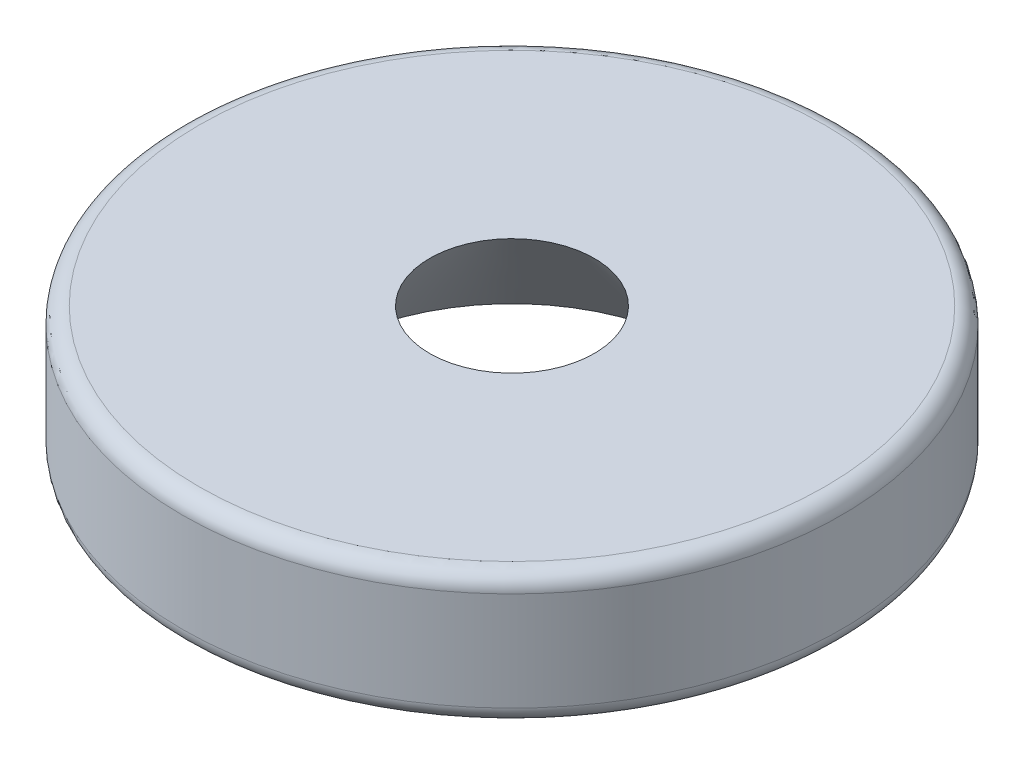
ISO-10303-21;
HEADER;
FILE_DESCRIPTION(('STEP AP214'),'2;1');
FILE_NAME('part.step','',(''),(''),'','','');
FILE_SCHEMA(('AUTOMOTIVE_DESIGN { 1 0 10303 214 1 1 1 1 }'));
ENDSEC;
DATA;
#1=APPLICATION_CONTEXT('core data for automotive mechanical design processes');
#2=APPLICATION_PROTOCOL_DEFINITION('international standard','automotive_design',2000,#1);
#3=PRODUCT_CONTEXT('',#1,'mechanical');
#4=PRODUCT('Part','Part','',(#3));
#5=PRODUCT_RELATED_PRODUCT_CATEGORY('part','',(#4));
#6=PRODUCT_DEFINITION_FORMATION('','',#4);
#7=PRODUCT_DEFINITION_CONTEXT('part definition',#1,'design');
#8=PRODUCT_DEFINITION('design','',#6,#7);
#9=PRODUCT_DEFINITION_SHAPE('','',#8);
#10=(LENGTH_UNIT() NAMED_UNIT(*) SI_UNIT(.MILLI.,.METRE.));
#11=(NAMED_UNIT(*) PLANE_ANGLE_UNIT() SI_UNIT($,.RADIAN.));
#12=(NAMED_UNIT(*) SI_UNIT($,.STERADIAN.) SOLID_ANGLE_UNIT());
#13=UNCERTAINTY_MEASURE_WITH_UNIT(LENGTH_MEASURE(1.E-05),#10,'distance_accuracy_value','');
#14=(GEOMETRIC_REPRESENTATION_CONTEXT(3) GLOBAL_UNCERTAINTY_ASSIGNED_CONTEXT((#13)) GLOBAL_UNIT_ASSIGNED_CONTEXT((#10,
#11,#12)) REPRESENTATION_CONTEXT('',''));
#15=CARTESIAN_POINT('',(0.,0.,0.));
#16=DIRECTION('',(0.,0.,1.));
#17=DIRECTION('',(1.,0.,0.));
#18=AXIS2_PLACEMENT_3D('',#15,#16,#17);
#19=CARTESIAN_POINT('',(0.,4.,0.));
#20=DIRECTION('',(0.,-1.,0.));
#21=DIRECTION('',(0.,0.,-1.));
#22=AXIS2_PLACEMENT_3D('',#19,#20,#21);
#23=CYLINDRICAL_SURFACE('',#22,10.);
#24=CARTESIAN_POINT('',(0.,3.5,0.));
#25=DIRECTION('',(0.,1.,0.));
#26=DIRECTION('',(0.,0.,1.));
#27=AXIS2_PLACEMENT_3D('',#24,#25,#26);
#28=CIRCLE('',#27,10.);
#29=CARTESIAN_POINT('',(0.,3.5,10.));
#30=VERTEX_POINT('',#29);
#31=EDGE_CURVE('E10',#30,#30,#28,.F.);
#32=ORIENTED_EDGE('',*,*,#31,.T.);
#33=EDGE_LOOP('',(#32));
#34=FACE_BOUND('',#33,.T.);
#35=CARTESIAN_POINT('',(0.,0.5,0.));
#36=DIRECTION('',(0.,1.,0.));
#37=DIRECTION('',(0.,0.,1.));
#38=AXIS2_PLACEMENT_3D('',#35,#36,#37);
#39=CIRCLE('',#38,10.);
#40=CARTESIAN_POINT('',(0.,0.5,10.));
#41=VERTEX_POINT('',#40);
#42=EDGE_CURVE('E48',#41,#41,#39,.T.);
#43=ORIENTED_EDGE('',*,*,#42,.T.);
#44=EDGE_LOOP('',(#43));
#45=FACE_BOUND('',#44,.T.);
#46=ADVANCED_FACE('F33',(#34,#45),#23,.T.);
#47=CARTESIAN_POINT('',(0.,4.,0.));
#48=DIRECTION('',(0.,1.,0.));
#49=DIRECTION('',(0.,0.,1.));
#50=AXIS2_PLACEMENT_3D('',#47,#48,#49);
#51=PLANE('',#50);
#52=CARTESIAN_POINT('',(0.,4.,0.));
#53=DIRECTION('',(0.,1.,0.));
#54=DIRECTION('',(0.,0.,1.));
#55=AXIS2_PLACEMENT_3D('',#52,#53,#54);
#56=CIRCLE('',#55,9.5);
#57=CARTESIAN_POINT('',(0.,4.,9.5));
#58=VERTEX_POINT('',#57);
#59=EDGE_CURVE('E40',#58,#58,#56,.T.);
#60=ORIENTED_EDGE('',*,*,#59,.T.);
#61=EDGE_LOOP('',(#60));
#62=FACE_BOUND('',#61,.T.);
#63=CARTESIAN_POINT('',(0.,4.,0.));
#64=DIRECTION('',(0.,1.,0.));
#65=DIRECTION('',(0.,0.,1.));
#66=AXIS2_PLACEMENT_3D('',#63,#64,#65);
#67=CIRCLE('',#66,2.5);
#68=CARTESIAN_POINT('',(0.,4.,2.5));
#69=VERTEX_POINT('',#68);
#70=EDGE_CURVE('E56',#69,#69,#67,.T.);
#71=ORIENTED_EDGE('',*,*,#70,.F.);
#72=EDGE_LOOP('',(#71));
#73=FACE_BOUND('',#72,.T.);
#74=ADVANCED_FACE('F62',(#62,#73),#51,.T.);
#75=CARTESIAN_POINT('',(0.,0.,0.));
#76=DIRECTION('',(0.,1.,0.));
#77=DIRECTION('',(0.,0.,1.));
#78=AXIS2_PLACEMENT_3D('',#75,#76,#77);
#79=PLANE('',#78);
#80=CARTESIAN_POINT('',(0.,0.,0.));
#81=DIRECTION('',(0.,1.,0.));
#82=DIRECTION('',(0.,0.,1.));
#83=AXIS2_PLACEMENT_3D('',#80,#81,#82);
#84=CIRCLE('',#83,9.5);
#85=CARTESIAN_POINT('',(0.,0.,9.5));
#86=VERTEX_POINT('',#85);
#87=EDGE_CURVE('E44',#86,#86,#84,.F.);
#88=ORIENTED_EDGE('',*,*,#87,.T.);
#89=EDGE_LOOP('',(#88));
#90=FACE_BOUND('',#89,.T.);
#91=CARTESIAN_POINT('',(0.,0.,0.));
#92=DIRECTION('',(0.,1.,0.));
#93=DIRECTION('',(0.,0.,1.));
#94=AXIS2_PLACEMENT_3D('',#91,#92,#93);
#95=CIRCLE('',#94,5.73913613278003);
#96=CARTESIAN_POINT('',(0.,0.,5.73913613278003));
#97=VERTEX_POINT('',#96);
#98=EDGE_CURVE('E53',#97,#97,#95,.T.);
#99=ORIENTED_EDGE('',*,*,#98,.T.);
#100=EDGE_LOOP('',(#99));
#101=FACE_BOUND('',#100,.T.);
#102=ADVANCED_FACE('F64',(#90,#101),#79,.F.);
#103=CARTESIAN_POINT('',(0.,4.,0.));
#104=DIRECTION('',(0.,-1.,0.));
#105=DIRECTION('',(0.,0.,1.));
#106=AXIS2_PLACEMENT_3D('',#103,#104,#105);
#107=CONICAL_SURFACE('',#106,2.5,0.680678408277789);
#108=ORIENTED_EDGE('',*,*,#98,.F.);
#109=EDGE_LOOP('',(#108));
#110=FACE_BOUND('',#109,.T.);
#111=ORIENTED_EDGE('',*,*,#70,.T.);
#112=EDGE_LOOP('',(#111));
#113=FACE_BOUND('',#112,.T.);
#114=ADVANCED_FACE('F60',(#110,#113),#107,.F.);
#115=CARTESIAN_POINT('',(0.,0.5,0.));
#116=DIRECTION('',(0.,1.,0.));
#117=DIRECTION('',(0.,0.,1.));
#118=AXIS2_PLACEMENT_3D('',#115,#116,#117);
#119=TOROIDAL_SURFACE('',#118,9.5,0.5);
#120=ORIENTED_EDGE('',*,*,#87,.F.);
#121=EDGE_LOOP('',(#120));
#122=FACE_BOUND('',#121,.T.);
#123=ORIENTED_EDGE('',*,*,#42,.F.);
#124=EDGE_LOOP('',(#123));
#125=FACE_BOUND('',#124,.T.);
#126=ADVANCED_FACE('F74',(#122,#125),#119,.T.);
#127=CARTESIAN_POINT('',(0.,3.5,0.));
#128=DIRECTION('',(0.,1.,0.));
#129=DIRECTION('',(0.,0.,1.));
#130=AXIS2_PLACEMENT_3D('',#127,#128,#129);
#131=TOROIDAL_SURFACE('',#130,9.5,0.5);
#132=ORIENTED_EDGE('',*,*,#31,.F.);
#133=EDGE_LOOP('',(#132));
#134=FACE_BOUND('',#133,.T.);
#135=ORIENTED_EDGE('',*,*,#59,.F.);
#136=EDGE_LOOP('',(#135));
#137=FACE_BOUND('',#136,.T.);
#138=ADVANCED_FACE('F35',(#134,#137),#131,.T.);
#139=CLOSED_SHELL('',(#46,#74,#102,#114,#126,#138));
#140=MANIFOLD_SOLID_BREP('B2',#139);
#141=ADVANCED_BREP_SHAPE_REPRESENTATION('',(#18,#140),#14);
#142=SHAPE_DEFINITION_REPRESENTATION(#9,#141);
ENDSEC;
END-ISO-10303-21;
